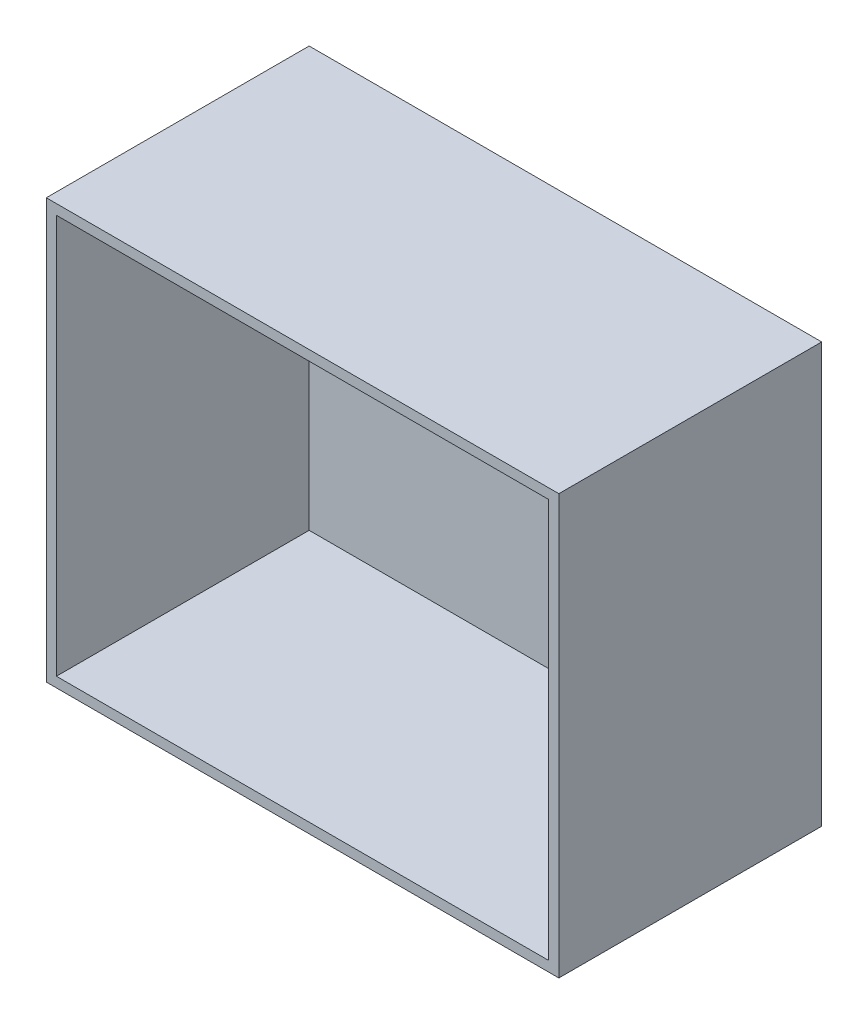
ISO-10303-21;
HEADER;
FILE_DESCRIPTION(('STEP AP214'),'2;1');
FILE_NAME('part.step','',(''),(''),'','','');
FILE_SCHEMA(('AUTOMOTIVE_DESIGN { 1 0 10303 214 1 1 1 1 }'));
ENDSEC;
DATA;
#1=APPLICATION_CONTEXT('core data for automotive mechanical design processes');
#2=APPLICATION_PROTOCOL_DEFINITION('international standard','automotive_design',2000,#1);
#3=PRODUCT_CONTEXT('',#1,'mechanical');
#4=PRODUCT('Part','Part','',(#3));
#5=PRODUCT_RELATED_PRODUCT_CATEGORY('part','',(#4));
#6=PRODUCT_DEFINITION_FORMATION('','',#4);
#7=PRODUCT_DEFINITION_CONTEXT('part definition',#1,'design');
#8=PRODUCT_DEFINITION('design','',#6,#7);
#9=PRODUCT_DEFINITION_SHAPE('','',#8);
#10=(LENGTH_UNIT() NAMED_UNIT(*) SI_UNIT(.MILLI.,.METRE.));
#11=(NAMED_UNIT(*) PLANE_ANGLE_UNIT() SI_UNIT($,.RADIAN.));
#12=(NAMED_UNIT(*) SI_UNIT($,.STERADIAN.) SOLID_ANGLE_UNIT());
#13=UNCERTAINTY_MEASURE_WITH_UNIT(LENGTH_MEASURE(1.E-05),#10,'distance_accuracy_value','');
#14=(GEOMETRIC_REPRESENTATION_CONTEXT(3) GLOBAL_UNCERTAINTY_ASSIGNED_CONTEXT((#13)) GLOBAL_UNIT_ASSIGNED_CONTEXT((#10,
#11,#12)) REPRESENTATION_CONTEXT('',''));
#15=CARTESIAN_POINT('',(0.,0.,0.));
#16=DIRECTION('',(0.,0.,1.));
#17=DIRECTION('',(1.,0.,0.));
#18=AXIS2_PLACEMENT_3D('',#15,#16,#17);
#19=CARTESIAN_POINT('',(-42.3243102365575,40.3763294306909,50.));
#20=DIRECTION('',(0.,0.,-1.));
#21=DIRECTION('',(-1.,0.,0.));
#22=AXIS2_PLACEMENT_3D('',#19,#20,#21);
#23=PLANE('',#22);
#24=DIRECTION('',(1.,0.,0.));
#25=VECTOR('',#24,1.);
#26=CARTESIAN_POINT('',(-42.3243102365575,42.3763294306909,50.));
#27=LINE('',#26,#25);
#28=CARTESIAN_POINT('',(57.0747300567757,42.3763294306909,50.));
#29=VERTEX_POINT('',#28);
#30=CARTESIAN_POINT('',(-44.3243102365575,42.3763294306909,50.));
#31=VERTEX_POINT('',#30);
#32=EDGE_CURVE('E152',#29,#31,#27,.F.);
#33=ORIENTED_EDGE('',*,*,#32,.T.);
#34=DIRECTION('',(0.,1.,0.));
#35=VECTOR('',#34,1.);
#36=CARTESIAN_POINT('',(-44.3243102365575,40.3763294306909,50.));
#37=LINE('',#36,#35);
#38=CARTESIAN_POINT('',(-44.3243102365575,-40.6054377889939,50.));
#39=VERTEX_POINT('',#38);
#40=EDGE_CURVE('E71',#31,#39,#37,.F.);
#41=ORIENTED_EDGE('',*,*,#40,.T.);
#42=DIRECTION('',(1.,0.,0.));
#43=VECTOR('',#42,1.);
#44=CARTESIAN_POINT('',(-42.3243102365575,-40.6054377889939,50.));
#45=LINE('',#44,#43);
#46=CARTESIAN_POINT('',(57.0747300567757,-40.6054377889939,50.));
#47=VERTEX_POINT('',#46);
#48=EDGE_CURVE('E315',#39,#47,#45,.T.);
#49=ORIENTED_EDGE('',*,*,#48,.T.);
#50=DIRECTION('',(0.,1.,0.));
#51=VECTOR('',#50,1.);
#52=CARTESIAN_POINT('',(57.0747300567757,40.3763294306909,50.));
#53=LINE('',#52,#51);
#54=EDGE_CURVE('E330',#47,#29,#53,.T.);
#55=ORIENTED_EDGE('',*,*,#54,.T.);
#56=EDGE_LOOP('',(#33,#41,#49,#55));
#57=FACE_BOUND('',#56,.T.);
#58=DIRECTION('',(-1.,0.,0.));
#59=VECTOR('',#58,1.);
#60=CARTESIAN_POINT('',(-42.3243102365575,40.3763294306909,50.));
#61=LINE('',#60,#59);
#62=CARTESIAN_POINT('',(55.0747300567757,40.3763294306909,50.));
#63=VERTEX_POINT('',#62);
#64=CARTESIAN_POINT('',(-42.3243102365575,40.3763294306909,50.));
#65=VERTEX_POINT('',#64);
#66=EDGE_CURVE('E157',#63,#65,#61,.T.);
#67=ORIENTED_EDGE('',*,*,#66,.F.);
#68=DIRECTION('',(0.,1.,0.));
#69=VECTOR('',#68,1.);
#70=CARTESIAN_POINT('',(55.0747300567757,40.3763294306909,50.));
#71=LINE('',#70,#69);
#72=CARTESIAN_POINT('',(55.0747300567757,-38.6054377889939,50.));
#73=VERTEX_POINT('',#72);
#74=EDGE_CURVE('E144',#73,#63,#71,.T.);
#75=ORIENTED_EDGE('',*,*,#74,.F.);
#76=DIRECTION('',(1.,0.,0.));
#77=VECTOR('',#76,1.);
#78=CARTESIAN_POINT('',(-42.3243102365575,-38.6054377889939,50.));
#79=LINE('',#78,#77);
#80=CARTESIAN_POINT('',(-42.3243102365575,-38.6054377889939,50.));
#81=VERTEX_POINT('',#80);
#82=EDGE_CURVE('E131',#81,#73,#79,.T.);
#83=ORIENTED_EDGE('',*,*,#82,.F.);
#84=DIRECTION('',(0.,-1.,0.));
#85=VECTOR('',#84,1.);
#86=CARTESIAN_POINT('',(-42.3243102365575,40.3763294306909,50.));
#87=LINE('',#86,#85);
#88=EDGE_CURVE('E143',#65,#81,#87,.T.);
#89=ORIENTED_EDGE('',*,*,#88,.F.);
#90=EDGE_LOOP('',(#67,#75,#83,#89));
#91=FACE_BOUND('',#90,.T.);
#92=ADVANCED_FACE('F61',(#57,#91),#23,.F.);
#93=CARTESIAN_POINT('',(-44.3243102365575,40.3763294306909,0.));
#94=DIRECTION('',(-1.,0.,0.));
#95=DIRECTION('',(0.,0.,1.));
#96=AXIS2_PLACEMENT_3D('',#93,#94,#95);
#97=PLANE('',#96);
#98=ORIENTED_EDGE('',*,*,#40,.F.);
#99=DIRECTION('',(0.,0.,1.));
#100=VECTOR('',#99,1.);
#101=CARTESIAN_POINT('',(-44.3243102365575,42.3763294306909,0.));
#102=LINE('',#101,#100);
#103=CARTESIAN_POINT('',(-44.3243102365575,42.3763294306909,-2.));
#104=VERTEX_POINT('',#103);
#105=EDGE_CURVE('E324',#104,#31,#102,.T.);
#106=ORIENTED_EDGE('',*,*,#105,.F.);
#107=CARTESIAN_POINT('',(-44.3243102365575,42.3763294306909,-2.));
#108=CARTESIAN_POINT('',(-44.3243102365575,35.7945141793544,-2.));
#109=CARTESIAN_POINT('',(-44.3243102365575,29.2126989280178,-2.));
#110=CARTESIAN_POINT('',(-44.3243102365575,16.0490684253448,-2.));
#111=CARTESIAN_POINT('',(-44.3243102365575,9.46725317400828,-2.));
#112=CARTESIAN_POINT('',(-44.3243102365576,-4.36304136260584,-2.));
#113=CARTESIAN_POINT('',(-44.3243102365575,-11.6115206478834,-2.));
#114=CARTESIAN_POINT('',(-44.3243102365575,-26.1084792184387,-2.));
#115=CARTESIAN_POINT('',(-44.3243102365575,-33.3569585037163,-2.));
#116=CARTESIAN_POINT('',(-44.3243102365575,-40.6054377889939,-2.));
#117=B_SPLINE_CURVE_WITH_KNOTS('',3,(#107,#108,#109,#110,#111,#112,#113,#114,#115,#116),
.UNSPECIFIED.,.F.,.F.,(4,2,2,2,4),(0.,19.7454457540095,39.4908915080191,61.2363293638519,
82.9817672196848),.UNSPECIFIED.);
#118=CARTESIAN_POINT('',(-44.3243102365575,-40.6054377889939,-2.));
#119=VERTEX_POINT('',#118);
#120=EDGE_CURVE('E13',#104,#119,#117,.T.);
#121=ORIENTED_EDGE('',*,*,#120,.T.);
#122=DIRECTION('',(0.,0.,1.));
#123=VECTOR('',#122,1.);
#124=CARTESIAN_POINT('',(-44.3243102365575,-40.6054377889939,0.));
#125=LINE('',#124,#123);
#126=EDGE_CURVE('E293',#119,#39,#125,.T.);
#127=ORIENTED_EDGE('',*,*,#126,.T.);
#128=EDGE_LOOP('',(#98,#106,#121,#127));
#129=FACE_BOUND('',#128,.T.);
#130=ADVANCED_FACE('F178',(#129),#97,.T.);
#131=CARTESIAN_POINT('',(-42.3243102365575,-40.6054377889939,0.));
#132=DIRECTION('',(0.,-1.,0.));
#133=DIRECTION('',(0.,0.,-1.));
#134=AXIS2_PLACEMENT_3D('',#131,#132,#133);
#135=PLANE('',#134);
#136=ORIENTED_EDGE('',*,*,#48,.F.);
#137=ORIENTED_EDGE('',*,*,#126,.F.);
#138=CARTESIAN_POINT('',(-44.3243102365575,-40.6054377889939,-2.));
#139=CARTESIAN_POINT('',(-31.1606797338845,-40.6054377889939,-2.));
#140=CARTESIAN_POINT('',(-17.9970492312115,-40.6054377889939,-2.));
#141=CARTESIAN_POINT('',(5.4846060690139,-40.6054377889939,-2.));
#142=CARTESIAN_POINT('',(15.8026308665663,-40.6054377889939,-2.));
#143=CARTESIAN_POINT('',(36.438680461671,-40.6054377889939,-2.));
#144=CARTESIAN_POINT('',(46.7567052592233,-40.6054377889939,-2.));
#145=CARTESIAN_POINT('',(57.0747300567757,-40.6054377889939,-2.));
#146=B_SPLINE_CURVE_WITH_KNOTS('',3,(#138,#139,#140,#141,#142,#143,#144,#145),.UNSPECIFIED.,.F.,
.F.,(4,2,2,4),(0.,39.4908915080191,70.4449659006761,101.399040293333),.UNSPECIFIED.);
#147=CARTESIAN_POINT('',(57.0747300567757,-40.6054377889939,-2.));
#148=VERTEX_POINT('',#147);
#149=EDGE_CURVE('E80',#119,#148,#146,.T.);
#150=ORIENTED_EDGE('',*,*,#149,.T.);
#151=DIRECTION('',(0.,0.,1.));
#152=VECTOR('',#151,1.);
#153=CARTESIAN_POINT('',(57.0747300567757,-40.6054377889939,0.));
#154=LINE('',#153,#152);
#155=EDGE_CURVE('E294',#148,#47,#154,.T.);
#156=ORIENTED_EDGE('',*,*,#155,.T.);
#157=EDGE_LOOP('',(#136,#137,#150,#156));
#158=FACE_BOUND('',#157,.T.);
#159=ADVANCED_FACE('F184',(#158),#135,.T.);
#160=CARTESIAN_POINT('',(57.0747300567757,40.3763294306909,0.));
#161=DIRECTION('',(1.,0.,0.));
#162=DIRECTION('',(0.,0.,-1.));
#163=AXIS2_PLACEMENT_3D('',#160,#161,#162);
#164=PLANE('',#163);
#165=ORIENTED_EDGE('',*,*,#54,.F.);
#166=ORIENTED_EDGE('',*,*,#155,.F.);
#167=CARTESIAN_POINT('',(57.0747300567757,-40.6054377889939,-2.));
#168=CARTESIAN_POINT('',(57.0747300567757,-34.0236225376574,-2.));
#169=CARTESIAN_POINT('',(57.0747300567757,-27.4418072863209,-2.));
#170=CARTESIAN_POINT('',(57.0747300567757,-14.2781767836478,-2.));
#171=CARTESIAN_POINT('',(57.0747300567757,-7.69636153231132,-2.));
#172=CARTESIAN_POINT('',(57.0747300567757,6.13393300430281,-2.));
#173=CARTESIAN_POINT('',(57.0747300567757,13.3824122895804,-2.));
#174=CARTESIAN_POINT('',(57.0747300567757,27.8793708601356,-2.));
#175=CARTESIAN_POINT('',(57.0747300567757,35.1278501454133,-2.));
#176=CARTESIAN_POINT('',(57.0747300567757,42.3763294306909,-2.));
#177=B_SPLINE_CURVE_WITH_KNOTS('',3,(#167,#168,#169,#170,#171,#172,#173,#174,#175,#176),
.UNSPECIFIED.,.F.,.F.,(4,2,2,2,4),(0.,19.7454457540095,39.4908915080191,61.2363293638519,
82.9817672196848),.UNSPECIFIED.);
#178=CARTESIAN_POINT('',(57.0747300567757,42.3763294306909,-2.));
#179=VERTEX_POINT('',#178);
#180=EDGE_CURVE('E309',#148,#179,#177,.T.);
#181=ORIENTED_EDGE('',*,*,#180,.T.);
#182=DIRECTION('',(0.,0.,1.));
#183=VECTOR('',#182,1.);
#184=CARTESIAN_POINT('',(57.0747300567757,42.3763294306909,0.));
#185=LINE('',#184,#183);
#186=EDGE_CURVE('E316',#179,#29,#185,.T.);
#187=ORIENTED_EDGE('',*,*,#186,.T.);
#188=EDGE_LOOP('',(#165,#166,#181,#187));
#189=FACE_BOUND('',#188,.T.);
#190=ADVANCED_FACE('F234',(#189),#164,.T.);
#191=CARTESIAN_POINT('',(-42.3243102365575,42.3763294306909,0.));
#192=DIRECTION('',(0.,1.,0.));
#193=DIRECTION('',(0.,0.,1.));
#194=AXIS2_PLACEMENT_3D('',#191,#192,#193);
#195=PLANE('',#194);
#196=ORIENTED_EDGE('',*,*,#32,.F.);
#197=ORIENTED_EDGE('',*,*,#186,.F.);
#198=CARTESIAN_POINT('',(57.0747300567757,42.3763294306909,-2.));
#199=CARTESIAN_POINT('',(43.9110995541026,42.3763294306909,-2.));
#200=CARTESIAN_POINT('',(30.7474690514296,42.3763294306909,-2.));
#201=CARTESIAN_POINT('',(7.26581375120422,42.3763294306909,-2.));
#202=CARTESIAN_POINT('',(-3.05221104634813,42.3763294306909,-2.));
#203=CARTESIAN_POINT('',(-23.6882606414528,42.3763294306909,-2.));
#204=CARTESIAN_POINT('',(-34.0062854390052,42.3763294306909,-2.));
#205=CARTESIAN_POINT('',(-44.3243102365575,42.3763294306909,-2.));
#206=B_SPLINE_CURVE_WITH_KNOTS('',3,(#198,#199,#200,#201,#202,#203,#204,#205),.UNSPECIFIED.,.F.,
.F.,(4,2,2,4),(0.,39.4908915080191,70.4449659006761,101.399040293333),.UNSPECIFIED.);
#207=EDGE_CURVE('E318',#179,#104,#206,.T.);
#208=ORIENTED_EDGE('',*,*,#207,.T.);
#209=ORIENTED_EDGE('',*,*,#105,.T.);
#210=EDGE_LOOP('',(#196,#197,#208,#209));
#211=FACE_BOUND('',#210,.T.);
#212=ADVANCED_FACE('F227',(#211),#195,.T.);
#213=CARTESIAN_POINT('',(57.0747300567757,42.3763294306909,0.));
#214=CARTESIAN_POINT('',(57.0747300567757,41.7096627640242,0.));
#215=CARTESIAN_POINT('',(57.0747300567757,41.0429960973575,0.));
#216=CARTESIAN_POINT('',(57.0747300567757,14.0490736907959,0.));
#217=CARTESIAN_POINT('',(57.0747300567757,-12.278182049099,0.));
#218=CARTESIAN_POINT('',(57.0747300567757,-39.2721044556606,0.));
#219=CARTESIAN_POINT('',(57.0747300567757,-39.9387711223272,0.));
#220=CARTESIAN_POINT('',(57.0747300567757,-40.6054377889939,0.));
#221=CARTESIAN_POINT('',(56.408063390109,42.3763294306909,0.));
#222=CARTESIAN_POINT('',(56.408063390109,41.7096627640242,0.));
#223=CARTESIAN_POINT('',(56.408063390109,41.0429960973575,0.));
#224=CARTESIAN_POINT('',(56.408063390109,14.0490736907959,0.));
#225=CARTESIAN_POINT('',(56.408063390109,-12.278182049099,0.));
#226=CARTESIAN_POINT('',(56.408063390109,-39.2721044556606,0.));
#227=CARTESIAN_POINT('',(56.408063390109,-39.9387711223272,0.));
#228=CARTESIAN_POINT('',(56.408063390109,-40.6054377889939,0.));
#229=CARTESIAN_POINT('',(55.7413967234423,42.3763294306909,0.));
#230=CARTESIAN_POINT('',(55.7413967234423,41.7096627640242,0.));
#231=CARTESIAN_POINT('',(55.7413967234423,41.0429960973575,0.));
#232=CARTESIAN_POINT('',(55.7413967234423,14.0490736907959,0.));
#233=CARTESIAN_POINT('',(55.7413967234423,-12.278182049099,0.));
#234=CARTESIAN_POINT('',(55.7413967234423,-39.2721044556606,0.));
#235=CARTESIAN_POINT('',(55.7413967234423,-39.9387711223272,0.));
#236=CARTESIAN_POINT('',(55.7413967234423,-40.6054377889939,0.));
#237=CARTESIAN_POINT('',(22.6083832923313,42.3763294306909,0.));
#238=CARTESIAN_POINT('',(22.6083832923313,41.7096627640242,0.));
#239=CARTESIAN_POINT('',(22.6083832923313,41.0429960973575,0.));
#240=CARTESIAN_POINT('',(22.6083832923313,14.0490736907959,0.));
#241=CARTESIAN_POINT('',(22.6083832923313,-12.278182049099,0.));
#242=CARTESIAN_POINT('',(22.6083832923313,-39.2721044556606,0.));
#243=CARTESIAN_POINT('',(22.6083832923313,-39.9387711223272,0.));
#244=CARTESIAN_POINT('',(22.6083832923313,-40.6054377889939,0.));
#245=CARTESIAN_POINT('',(-9.85796347211313,42.3763294306909,0.));
#246=CARTESIAN_POINT('',(-9.85796347211313,41.7096627640242,0.));
#247=CARTESIAN_POINT('',(-9.85796347211313,41.0429960973575,0.));
#248=CARTESIAN_POINT('',(-9.85796347211313,14.0490736907959,0.));
#249=CARTESIAN_POINT('',(-9.85796347211313,-12.278182049099,0.));
#250=CARTESIAN_POINT('',(-9.85796347211313,-39.2721044556606,0.));
#251=CARTESIAN_POINT('',(-9.85796347211313,-39.9387711223272,0.));
#252=CARTESIAN_POINT('',(-9.85796347211313,-40.6054377889939,0.));
#253=CARTESIAN_POINT('',(-42.9909769032242,42.3763294306909,0.));
#254=CARTESIAN_POINT('',(-42.9909769032242,41.7096627640242,0.));
#255=CARTESIAN_POINT('',(-42.9909769032242,41.0429960973575,0.));
#256=CARTESIAN_POINT('',(-42.9909769032242,14.0490736907959,0.));
#257=CARTESIAN_POINT('',(-42.9909769032242,-12.278182049099,0.));
#258=CARTESIAN_POINT('',(-42.9909769032242,-39.2721044556606,0.));
#259=CARTESIAN_POINT('',(-42.9909769032242,-39.9387711223272,0.));
#260=CARTESIAN_POINT('',(-42.9909769032242,-40.6054377889939,0.));
#261=CARTESIAN_POINT('',(-43.6576435698909,42.3763294306909,0.));
#262=CARTESIAN_POINT('',(-43.6576435698909,41.7096627640242,0.));
#263=CARTESIAN_POINT('',(-43.6576435698909,41.0429960973575,0.));
#264=CARTESIAN_POINT('',(-43.6576435698909,14.0490736907959,0.));
#265=CARTESIAN_POINT('',(-43.6576435698909,-12.278182049099,0.));
#266=CARTESIAN_POINT('',(-43.6576435698909,-39.2721044556606,0.));
#267=CARTESIAN_POINT('',(-43.6576435698909,-39.9387711223272,0.));
#268=CARTESIAN_POINT('',(-43.6576435698909,-40.6054377889939,0.));
#269=CARTESIAN_POINT('',(-44.3243102365575,42.3763294306909,0.));
#270=CARTESIAN_POINT('',(-44.3243102365575,41.7096627640242,0.));
#271=CARTESIAN_POINT('',(-44.3243102365575,41.0429960973575,0.));
#272=CARTESIAN_POINT('',(-44.3243102365575,14.0490736907959,0.));
#273=CARTESIAN_POINT('',(-44.3243102365575,-12.278182049099,0.));
#274=CARTESIAN_POINT('',(-44.3243102365575,-39.2721044556606,0.));
#275=CARTESIAN_POINT('',(-44.3243102365575,-39.9387711223272,0.));
#276=CARTESIAN_POINT('',(-44.3243102365575,-40.6054377889939,0.));
#277=B_SPLINE_SURFACE_WITH_KNOTS('',3,3,((#213,#214,#215,#216,#217,#218,#219,#220),(#221,#222,
#223,#224,#225,#226,#227,#228),(#229,#230,#231,#232,#233,#234,#235,#236),(#237,#238,#239,#240,
#241,#242,#243,#244),(#245,#246,#247,#248,#249,#250,#251,#252),(#253,#254,#255,#256,#257,#258,
#259,#260),(#261,#262,#263,#264,#265,#266,#267,#268),(#269,#270,#271,#272,#273,#274,#275,#276)),
.UNSPECIFIED.,.F.,.F.,.F.,(4,2,2,4),(4,2,2,4),(-0.020534083230971,0.,1.,1.02053408323097),
(-0.0253222999485068,0.,1.,1.02532229994851),.UNSPECIFIED.);
#278=OFFSET_SURFACE('',#277,-2.,.F.);
#279=ORIENTED_EDGE('',*,*,#207,.F.);
#280=ORIENTED_EDGE('',*,*,#180,.F.);
#281=ORIENTED_EDGE('',*,*,#149,.F.);
#282=ORIENTED_EDGE('',*,*,#120,.F.);
#283=EDGE_LOOP('',(#279,#280,#281,#282));
#284=FACE_BOUND('',#283,.T.);
#285=ADVANCED_FACE('F190',(#284),#278,.F.);
#286=CARTESIAN_POINT('',(-42.3243102365575,40.3763294306909,0.));
#287=DIRECTION('',(-1.,0.,0.));
#288=DIRECTION('',(0.,0.,1.));
#289=AXIS2_PLACEMENT_3D('',#286,#287,#288);
#290=PLANE('',#289);
#291=ORIENTED_EDGE('',*,*,#88,.T.);
#292=DIRECTION('',(0.,0.,1.));
#293=VECTOR('',#292,1.);
#294=CARTESIAN_POINT('',(-42.3243102365575,-38.6054377889939,0.));
#295=LINE('',#294,#293);
#296=CARTESIAN_POINT('',(-42.3243102365575,-38.6054377889939,0.));
#297=VERTEX_POINT('',#296);
#298=EDGE_CURVE('E128',#297,#81,#295,.T.);
#299=ORIENTED_EDGE('',*,*,#298,.F.);
#300=DIRECTION('',(0.,-1.,0.));
#301=VECTOR('',#300,1.);
#302=CARTESIAN_POINT('',(-42.3243102365575,40.3763294306909,0.));
#303=LINE('',#302,#301);
#304=CARTESIAN_POINT('',(-42.3243102365575,40.3763294306909,0.));
#305=VERTEX_POINT('',#304);
#306=EDGE_CURVE('E150',#305,#297,#303,.T.);
#307=ORIENTED_EDGE('',*,*,#306,.F.);
#308=DIRECTION('',(0.,0.,1.));
#309=VECTOR('',#308,1.);
#310=CARTESIAN_POINT('',(-42.3243102365575,40.3763294306909,0.));
#311=LINE('',#310,#309);
#312=EDGE_CURVE('E65',#305,#65,#311,.T.);
#313=ORIENTED_EDGE('',*,*,#312,.T.);
#314=EDGE_LOOP('',(#291,#299,#307,#313));
#315=FACE_BOUND('',#314,.T.);
#316=ADVANCED_FACE('F147',(#315),#290,.F.);
#317=CARTESIAN_POINT('',(-42.3243102365575,-38.6054377889939,0.));
#318=DIRECTION('',(0.,-1.,0.));
#319=DIRECTION('',(0.,0.,-1.));
#320=AXIS2_PLACEMENT_3D('',#317,#318,#319);
#321=PLANE('',#320);
#322=ORIENTED_EDGE('',*,*,#82,.T.);
#323=DIRECTION('',(0.,0.,1.));
#324=VECTOR('',#323,1.);
#325=CARTESIAN_POINT('',(55.0747300567757,-38.6054377889939,0.));
#326=LINE('',#325,#324);
#327=CARTESIAN_POINT('',(55.0747300567757,-38.6054377889939,0.));
#328=VERTEX_POINT('',#327);
#329=EDGE_CURVE('E123',#328,#73,#326,.T.);
#330=ORIENTED_EDGE('',*,*,#329,.F.);
#331=DIRECTION('',(1.,0.,0.));
#332=VECTOR('',#331,1.);
#333=CARTESIAN_POINT('',(-42.3243102365575,-38.6054377889939,0.));
#334=LINE('',#333,#332);
#335=EDGE_CURVE('E134',#297,#328,#334,.T.);
#336=ORIENTED_EDGE('',*,*,#335,.F.);
#337=ORIENTED_EDGE('',*,*,#298,.T.);
#338=EDGE_LOOP('',(#322,#330,#336,#337));
#339=FACE_BOUND('',#338,.T.);
#340=ADVANCED_FACE('F130',(#339),#321,.F.);
#341=CARTESIAN_POINT('',(55.0747300567757,40.3763294306909,0.));
#342=DIRECTION('',(1.,0.,0.));
#343=DIRECTION('',(0.,0.,-1.));
#344=AXIS2_PLACEMENT_3D('',#341,#342,#343);
#345=PLANE('',#344);
#346=ORIENTED_EDGE('',*,*,#74,.T.);
#347=DIRECTION('',(0.,0.,1.));
#348=VECTOR('',#347,1.);
#349=CARTESIAN_POINT('',(55.0747300567757,40.3763294306909,0.));
#350=LINE('',#349,#348);
#351=CARTESIAN_POINT('',(55.0747300567757,40.3763294306909,0.));
#352=VERTEX_POINT('',#351);
#353=EDGE_CURVE('E159',#352,#63,#350,.T.);
#354=ORIENTED_EDGE('',*,*,#353,.F.);
#355=DIRECTION('',(0.,1.,0.));
#356=VECTOR('',#355,1.);
#357=CARTESIAN_POINT('',(55.0747300567757,40.3763294306909,0.));
#358=LINE('',#357,#356);
#359=EDGE_CURVE('E145',#328,#352,#358,.T.);
#360=ORIENTED_EDGE('',*,*,#359,.F.);
#361=ORIENTED_EDGE('',*,*,#329,.T.);
#362=EDGE_LOOP('',(#346,#354,#360,#361));
#363=FACE_BOUND('',#362,.T.);
#364=ADVANCED_FACE('F167',(#363),#345,.F.);
#365=CARTESIAN_POINT('',(-42.3243102365575,40.3763294306909,0.));
#366=DIRECTION('',(0.,1.,0.));
#367=DIRECTION('',(0.,0.,1.));
#368=AXIS2_PLACEMENT_3D('',#365,#366,#367);
#369=PLANE('',#368);
#370=ORIENTED_EDGE('',*,*,#66,.T.);
#371=ORIENTED_EDGE('',*,*,#312,.F.);
#372=DIRECTION('',(-1.,0.,0.));
#373=VECTOR('',#372,1.);
#374=CARTESIAN_POINT('',(-42.3243102365575,40.3763294306909,0.));
#375=LINE('',#374,#373);
#376=EDGE_CURVE('E161',#352,#305,#375,.T.);
#377=ORIENTED_EDGE('',*,*,#376,.F.);
#378=ORIENTED_EDGE('',*,*,#353,.T.);
#379=EDGE_LOOP('',(#370,#371,#377,#378));
#380=FACE_BOUND('',#379,.T.);
#381=ADVANCED_FACE('F168',(#380),#369,.F.);
#382=CARTESIAN_POINT('',(55.0747300567757,40.3763294306909,0.));
#383=DIRECTION('',(0.,0.,1.));
#384=DIRECTION('',(-1.,0.,0.));
#385=AXIS2_PLACEMENT_3D('',#382,#383,#384);
#386=PLANE('',#385);
#387=ORIENTED_EDGE('',*,*,#376,.T.);
#388=ORIENTED_EDGE('',*,*,#306,.T.);
#389=ORIENTED_EDGE('',*,*,#335,.T.);
#390=ORIENTED_EDGE('',*,*,#359,.T.);
#391=EDGE_LOOP('',(#387,#388,#389,#390));
#392=FACE_BOUND('',#391,.T.);
#393=ADVANCED_FACE('F63',(#392),#386,.T.);
#394=CLOSED_SHELL('',(#92,#130,#159,#190,#212,#285,#316,#340,#364,#381,#393));
#395=MANIFOLD_SOLID_BREP('B2',#394);
#396=ADVANCED_BREP_SHAPE_REPRESENTATION('',(#18,#395),#14);
#397=SHAPE_DEFINITION_REPRESENTATION(#9,#396);
ENDSEC;
END-ISO-10303-21;
